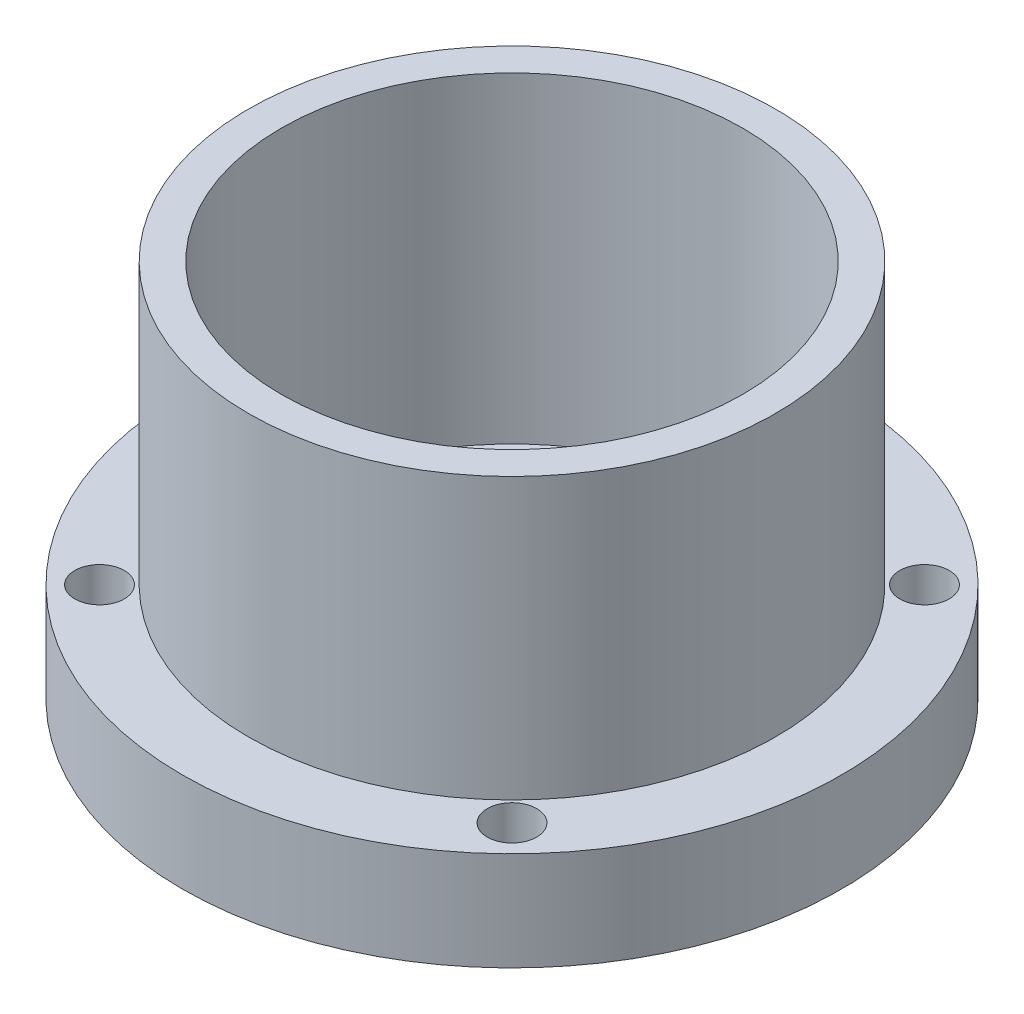
ISO-10303-21;
HEADER;
FILE_DESCRIPTION(('STEP AP214'),'2;1');
FILE_NAME('part.step','',(''),(''),'','','');
FILE_SCHEMA(('AUTOMOTIVE_DESIGN { 1 0 10303 214 1 1 1 1 }'));
ENDSEC;
DATA;
#1=APPLICATION_CONTEXT('core data for automotive mechanical design processes');
#2=APPLICATION_PROTOCOL_DEFINITION('international standard','automotive_design',2000,#1);
#3=PRODUCT_CONTEXT('',#1,'mechanical');
#4=PRODUCT('Part','Part','',(#3));
#5=PRODUCT_RELATED_PRODUCT_CATEGORY('part','',(#4));
#6=PRODUCT_DEFINITION_FORMATION('','',#4);
#7=PRODUCT_DEFINITION_CONTEXT('part definition',#1,'design');
#8=PRODUCT_DEFINITION('design','',#6,#7);
#9=PRODUCT_DEFINITION_SHAPE('','',#8);
#10=(LENGTH_UNIT() NAMED_UNIT(*) SI_UNIT(.MILLI.,.METRE.));
#11=(NAMED_UNIT(*) PLANE_ANGLE_UNIT() SI_UNIT($,.RADIAN.));
#12=(NAMED_UNIT(*) SI_UNIT($,.STERADIAN.) SOLID_ANGLE_UNIT());
#13=UNCERTAINTY_MEASURE_WITH_UNIT(LENGTH_MEASURE(1.E-05),#10,'distance_accuracy_value','');
#14=(GEOMETRIC_REPRESENTATION_CONTEXT(3) GLOBAL_UNCERTAINTY_ASSIGNED_CONTEXT((#13)) GLOBAL_UNIT_ASSIGNED_CONTEXT((#10,
#11,#12)) REPRESENTATION_CONTEXT('',''));
#15=CARTESIAN_POINT('',(0.,0.,0.));
#16=DIRECTION('',(0.,0.,1.));
#17=DIRECTION('',(1.,0.,0.));
#18=AXIS2_PLACEMENT_3D('',#15,#16,#17);
#19=CARTESIAN_POINT('',(-19.0091828831705,220.5,-53.2448828787845));
#20=DIRECTION('',(0.,1.,0.));
#21=DIRECTION('',(0.,0.,-1.));
#22=AXIS2_PLACEMENT_3D('',#19,#20,#21);
#23=CYLINDRICAL_SURFACE('',#22,16.);
#24=CARTESIAN_POINT('',(-19.0091828831705,220.5,-53.2448828787845));
#25=DIRECTION('',(0.,1.,0.));
#26=DIRECTION('',(0.,0.,1.));
#27=AXIS2_PLACEMENT_3D('',#24,#25,#26);
#28=CIRCLE('',#27,16.);
#29=CARTESIAN_POINT('',(-19.0091828831705,220.5,-37.2448828787845));
#30=VERTEX_POINT('',#29);
#31=EDGE_CURVE('E10',#30,#30,#28,.T.);
#32=ORIENTED_EDGE('',*,*,#31,.T.);
#33=EDGE_LOOP('',(#32));
#34=FACE_BOUND('',#33,.T.);
#35=CARTESIAN_POINT('',(-19.0091828831705,237.5,-53.2448828787845));
#36=DIRECTION('',(0.,1.,0.));
#37=DIRECTION('',(0.,0.,1.));
#38=AXIS2_PLACEMENT_3D('',#35,#36,#37);
#39=CIRCLE('',#38,16.);
#40=CARTESIAN_POINT('',(-19.0091828831705,237.5,-37.2448828787845));
#41=VERTEX_POINT('',#40);
#42=EDGE_CURVE('E46',#41,#41,#39,.T.);
#43=ORIENTED_EDGE('',*,*,#42,.F.);
#44=EDGE_LOOP('',(#43));
#45=FACE_BOUND('',#44,.T.);
#46=ADVANCED_FACE('F39',(#34,#45),#23,.T.);
#47=CARTESIAN_POINT('',(-19.0091828831705,237.5,-53.2448828787845));
#48=DIRECTION('',(0.,-1.,0.));
#49=DIRECTION('',(0.,0.,1.));
#50=AXIS2_PLACEMENT_3D('',#47,#48,#49);
#51=PLANE('',#50);
#52=CARTESIAN_POINT('',(-19.0091828831705,237.5,-53.2448828787845));
#53=DIRECTION('',(0.,1.,0.));
#54=DIRECTION('',(0.,0.,1.));
#55=AXIS2_PLACEMENT_3D('',#52,#53,#54);
#56=CIRCLE('',#55,14.);
#57=CARTESIAN_POINT('',(-19.0091828831705,237.5,-39.2448828787845));
#58=VERTEX_POINT('',#57);
#59=EDGE_CURVE('E60',#58,#58,#56,.F.);
#60=ORIENTED_EDGE('',*,*,#59,.T.);
#61=EDGE_LOOP('',(#60));
#62=FACE_BOUND('',#61,.T.);
#63=ORIENTED_EDGE('',*,*,#42,.T.);
#64=EDGE_LOOP('',(#63));
#65=FACE_BOUND('',#64,.T.);
#66=ADVANCED_FACE('F105',(#62,#65),#51,.F.);
#67=CARTESIAN_POINT('',(-19.0091828831705,214.5,-53.2448828787845));
#68=DIRECTION('',(0.,1.,0.));
#69=DIRECTION('',(0.,0.,-1.));
#70=AXIS2_PLACEMENT_3D('',#67,#68,#69);
#71=CYLINDRICAL_SURFACE('',#70,20.);
#72=CARTESIAN_POINT('',(-19.0091828831705,214.5,-53.2448828787845));
#73=DIRECTION('',(0.,1.,0.));
#74=DIRECTION('',(0.,0.,1.));
#75=AXIS2_PLACEMENT_3D('',#72,#73,#74);
#76=CIRCLE('',#75,20.);
#77=CARTESIAN_POINT('',(-19.0091828831705,214.5,-33.2448828787845));
#78=VERTEX_POINT('',#77);
#79=EDGE_CURVE('E51',#78,#78,#76,.T.);
#80=ORIENTED_EDGE('',*,*,#79,.T.);
#81=EDGE_LOOP('',(#80));
#82=FACE_BOUND('',#81,.T.);
#83=CARTESIAN_POINT('',(-19.0091828831705,220.5,-53.2448828787845));
#84=DIRECTION('',(0.,1.,0.));
#85=DIRECTION('',(0.,0.,1.));
#86=AXIS2_PLACEMENT_3D('',#83,#84,#85);
#87=CIRCLE('',#86,20.);
#88=CARTESIAN_POINT('',(-19.0091828831705,220.5,-33.2448828787845));
#89=VERTEX_POINT('',#88);
#90=EDGE_CURVE('E53',#89,#89,#87,.T.);
#91=ORIENTED_EDGE('',*,*,#90,.F.);
#92=EDGE_LOOP('',(#91));
#93=FACE_BOUND('',#92,.T.);
#94=ADVANCED_FACE('F100',(#82,#93),#71,.T.);
#95=CARTESIAN_POINT('',(-19.0091828831705,214.5,-53.2448828787845));
#96=DIRECTION('',(0.,-1.,0.));
#97=DIRECTION('',(0.,0.,1.));
#98=AXIS2_PLACEMENT_3D('',#95,#96,#97);
#99=PLANE('',#98);
#100=CARTESIAN_POINT('',(-6.49339285616864,214.5,-65.7606729057864));
#101=DIRECTION('',(0.,1.,0.));
#102=DIRECTION('',(0.,0.,1.));
#103=AXIS2_PLACEMENT_3D('',#100,#101,#102);
#104=CIRCLE('',#103,1.5);
#105=CARTESIAN_POINT('',(-6.49339285616864,214.5,-64.2606729057864));
#106=VERTEX_POINT('',#105);
#107=EDGE_CURVE('E83',#106,#106,#104,.F.);
#108=ORIENTED_EDGE('',*,*,#107,.F.);
#109=EDGE_LOOP('',(#108));
#110=FACE_BOUND('',#109,.T.);
#111=CARTESIAN_POINT('',(-31.5249729101724,214.5,-65.7606729057864));
#112=DIRECTION('',(0.,1.,0.));
#113=DIRECTION('',(0.,0.,1.));
#114=AXIS2_PLACEMENT_3D('',#111,#112,#113);
#115=CIRCLE('',#114,1.5);
#116=CARTESIAN_POINT('',(-31.5249729101724,214.5,-64.2606729057864));
#117=VERTEX_POINT('',#116);
#118=EDGE_CURVE('E71',#117,#117,#115,.F.);
#119=ORIENTED_EDGE('',*,*,#118,.F.);
#120=EDGE_LOOP('',(#119));
#121=FACE_BOUND('',#120,.T.);
#122=CARTESIAN_POINT('',(-31.5249729101724,214.5,-40.7290928517826));
#123=DIRECTION('',(0.,1.,0.));
#124=DIRECTION('',(0.,0.,1.));
#125=AXIS2_PLACEMENT_3D('',#122,#123,#124);
#126=CIRCLE('',#125,1.5);
#127=CARTESIAN_POINT('',(-31.5249729101724,214.5,-39.2290928517826));
#128=VERTEX_POINT('',#127);
#129=EDGE_CURVE('E72',#128,#128,#126,.F.);
#130=ORIENTED_EDGE('',*,*,#129,.F.);
#131=EDGE_LOOP('',(#130));
#132=FACE_BOUND('',#131,.T.);
#133=CARTESIAN_POINT('',(-6.49339285616864,214.5,-40.7290928517826));
#134=DIRECTION('',(0.,1.,0.));
#135=DIRECTION('',(0.,0.,1.));
#136=AXIS2_PLACEMENT_3D('',#133,#134,#135);
#137=CIRCLE('',#136,1.5);
#138=CARTESIAN_POINT('',(-6.49339285616864,214.5,-39.2290928517826));
#139=VERTEX_POINT('',#138);
#140=EDGE_CURVE('E69',#139,#139,#137,.F.);
#141=ORIENTED_EDGE('',*,*,#140,.F.);
#142=EDGE_LOOP('',(#141));
#143=FACE_BOUND('',#142,.T.);
#144=CARTESIAN_POINT('',(-19.0091828831705,214.5,-53.2448828787845));
#145=DIRECTION('',(0.,1.,0.));
#146=DIRECTION('',(0.,0.,1.));
#147=AXIS2_PLACEMENT_3D('',#144,#145,#146);
#148=CIRCLE('',#147,13.);
#149=CARTESIAN_POINT('',(-19.0091828831705,214.5,-40.2448828787845));
#150=VERTEX_POINT('',#149);
#151=EDGE_CURVE('E62',#150,#150,#148,.F.);
#152=ORIENTED_EDGE('',*,*,#151,.F.);
#153=EDGE_LOOP('',(#152));
#154=FACE_BOUND('',#153,.T.);
#155=ORIENTED_EDGE('',*,*,#79,.F.);
#156=EDGE_LOOP('',(#155));
#157=FACE_BOUND('',#156,.T.);
#158=ADVANCED_FACE('F103',(#110,#121,#132,#143,#154,#157),#99,.T.);
#159=CARTESIAN_POINT('',(-19.0091828831705,220.5,-53.2448828787845));
#160=DIRECTION('',(0.,-1.,0.));
#161=DIRECTION('',(0.,0.,1.));
#162=AXIS2_PLACEMENT_3D('',#159,#160,#161);
#163=PLANE('',#162);
#164=CARTESIAN_POINT('',(-6.49339285616864,220.5,-65.7606729057864));
#165=DIRECTION('',(0.,1.,0.));
#166=DIRECTION('',(0.,0.,1.));
#167=AXIS2_PLACEMENT_3D('',#164,#165,#166);
#168=CIRCLE('',#167,1.5);
#169=CARTESIAN_POINT('',(-6.49339285616864,220.5,-64.2606729057864));
#170=VERTEX_POINT('',#169);
#171=EDGE_CURVE('E45',#170,#170,#168,.F.);
#172=ORIENTED_EDGE('',*,*,#171,.T.);
#173=EDGE_LOOP('',(#172));
#174=FACE_BOUND('',#173,.T.);
#175=CARTESIAN_POINT('',(-31.5249729101724,220.5,-65.7606729057864));
#176=DIRECTION('',(0.,1.,0.));
#177=DIRECTION('',(0.,0.,1.));
#178=AXIS2_PLACEMENT_3D('',#175,#176,#177);
#179=CIRCLE('',#178,1.5);
#180=CARTESIAN_POINT('',(-31.5249729101724,220.5,-64.2606729057864));
#181=VERTEX_POINT('',#180);
#182=EDGE_CURVE('E74',#181,#181,#179,.F.);
#183=ORIENTED_EDGE('',*,*,#182,.T.);
#184=EDGE_LOOP('',(#183));
#185=FACE_BOUND('',#184,.T.);
#186=CARTESIAN_POINT('',(-31.5249729101724,220.5,-40.7290928517826));
#187=DIRECTION('',(0.,1.,0.));
#188=DIRECTION('',(0.,0.,1.));
#189=AXIS2_PLACEMENT_3D('',#186,#187,#188);
#190=CIRCLE('',#189,1.5);
#191=CARTESIAN_POINT('',(-31.5249729101724,220.5,-39.2290928517826));
#192=VERTEX_POINT('',#191);
#193=EDGE_CURVE('E66',#192,#192,#190,.F.);
#194=ORIENTED_EDGE('',*,*,#193,.T.);
#195=EDGE_LOOP('',(#194));
#196=FACE_BOUND('',#195,.T.);
#197=CARTESIAN_POINT('',(-6.49339285616864,220.5,-40.7290928517826));
#198=DIRECTION('',(0.,1.,0.));
#199=DIRECTION('',(0.,0.,1.));
#200=AXIS2_PLACEMENT_3D('',#197,#198,#199);
#201=CIRCLE('',#200,1.5);
#202=CARTESIAN_POINT('',(-6.49339285616864,220.5,-39.2290928517826));
#203=VERTEX_POINT('',#202);
#204=EDGE_CURVE('E63',#203,#203,#201,.F.);
#205=ORIENTED_EDGE('',*,*,#204,.T.);
#206=EDGE_LOOP('',(#205));
#207=FACE_BOUND('',#206,.T.);
#208=ORIENTED_EDGE('',*,*,#31,.F.);
#209=EDGE_LOOP('',(#208));
#210=FACE_BOUND('',#209,.T.);
#211=ORIENTED_EDGE('',*,*,#90,.T.);
#212=EDGE_LOOP('',(#211));
#213=FACE_BOUND('',#212,.T.);
#214=ADVANCED_FACE('F97',(#174,#185,#196,#207,#210,#213),#163,.F.);
#215=CARTESIAN_POINT('',(-19.0091828831705,218.,-53.2448828787845));
#216=DIRECTION('',(0.,1.,0.));
#217=DIRECTION('',(0.,0.,-1.));
#218=AXIS2_PLACEMENT_3D('',#215,#216,#217);
#219=CYLINDRICAL_SURFACE('',#218,14.);
#220=CARTESIAN_POINT('',(-19.0091828831705,218.,-53.2448828787845));
#221=DIRECTION('',(0.,1.,0.));
#222=DIRECTION('',(0.,0.,1.));
#223=AXIS2_PLACEMENT_3D('',#220,#221,#222);
#224=CIRCLE('',#223,14.);
#225=CARTESIAN_POINT('',(-19.0091828831705,218.,-39.2448828787845));
#226=VERTEX_POINT('',#225);
#227=EDGE_CURVE('E58',#226,#226,#224,.T.);
#228=ORIENTED_EDGE('',*,*,#227,.F.);
#229=EDGE_LOOP('',(#228));
#230=FACE_BOUND('',#229,.T.);
#231=ORIENTED_EDGE('',*,*,#59,.F.);
#232=EDGE_LOOP('',(#231));
#233=FACE_BOUND('',#232,.T.);
#234=ADVANCED_FACE('F143',(#230,#233),#219,.F.);
#235=CARTESIAN_POINT('',(-19.0091828831705,218.,-53.2448828787845));
#236=DIRECTION('',(0.,-1.,0.));
#237=DIRECTION('',(0.,0.,1.));
#238=AXIS2_PLACEMENT_3D('',#235,#236,#237);
#239=PLANE('',#238);
#240=CARTESIAN_POINT('',(-19.0091828831705,218.,-53.2448828787845));
#241=DIRECTION('',(0.,1.,0.));
#242=DIRECTION('',(0.,0.,1.));
#243=AXIS2_PLACEMENT_3D('',#240,#241,#242);
#244=CIRCLE('',#243,13.);
#245=CARTESIAN_POINT('',(-19.0091828831705,218.,-40.2448828787845));
#246=VERTEX_POINT('',#245);
#247=EDGE_CURVE('E61',#246,#246,#244,.T.);
#248=ORIENTED_EDGE('',*,*,#247,.F.);
#249=EDGE_LOOP('',(#248));
#250=FACE_BOUND('',#249,.T.);
#251=ORIENTED_EDGE('',*,*,#227,.T.);
#252=EDGE_LOOP('',(#251));
#253=FACE_BOUND('',#252,.T.);
#254=ADVANCED_FACE('F154',(#250,#253),#239,.F.);
#255=CARTESIAN_POINT('',(-19.0091828831705,214.4,-53.2448828787845));
#256=DIRECTION('',(0.,1.,0.));
#257=DIRECTION('',(0.,0.,-1.));
#258=AXIS2_PLACEMENT_3D('',#255,#256,#257);
#259=CYLINDRICAL_SURFACE('',#258,13.);
#260=ORIENTED_EDGE('',*,*,#151,.T.);
#261=EDGE_LOOP('',(#260));
#262=FACE_BOUND('',#261,.T.);
#263=ORIENTED_EDGE('',*,*,#247,.T.);
#264=EDGE_LOOP('',(#263));
#265=FACE_BOUND('',#264,.T.);
#266=ADVANCED_FACE('F161',(#262,#265),#259,.F.);
#267=CARTESIAN_POINT('',(-6.49339285616864,214.4,-40.7290928517826));
#268=DIRECTION('',(0.,1.,0.));
#269=DIRECTION('',(0.,0.,-1.));
#270=AXIS2_PLACEMENT_3D('',#267,#268,#269);
#271=CYLINDRICAL_SURFACE('',#270,1.5);
#272=ORIENTED_EDGE('',*,*,#140,.T.);
#273=EDGE_LOOP('',(#272));
#274=FACE_BOUND('',#273,.T.);
#275=ORIENTED_EDGE('',*,*,#204,.F.);
#276=EDGE_LOOP('',(#275));
#277=FACE_BOUND('',#276,.T.);
#278=ADVANCED_FACE('F173',(#274,#277),#271,.F.);
#279=CARTESIAN_POINT('',(-31.5249729101724,214.4,-40.7290928517826));
#280=DIRECTION('',(0.,1.,0.));
#281=DIRECTION('',(0.,0.,-1.));
#282=AXIS2_PLACEMENT_3D('',#279,#280,#281);
#283=CYLINDRICAL_SURFACE('',#282,1.5);
#284=ORIENTED_EDGE('',*,*,#129,.T.);
#285=EDGE_LOOP('',(#284));
#286=FACE_BOUND('',#285,.T.);
#287=ORIENTED_EDGE('',*,*,#193,.F.);
#288=EDGE_LOOP('',(#287));
#289=FACE_BOUND('',#288,.T.);
#290=ADVANCED_FACE('F182',(#286,#289),#283,.F.);
#291=CARTESIAN_POINT('',(-31.5249729101724,214.4,-65.7606729057864));
#292=DIRECTION('',(0.,1.,0.));
#293=DIRECTION('',(0.,0.,-1.));
#294=AXIS2_PLACEMENT_3D('',#291,#292,#293);
#295=CYLINDRICAL_SURFACE('',#294,1.5);
#296=ORIENTED_EDGE('',*,*,#118,.T.);
#297=EDGE_LOOP('',(#296));
#298=FACE_BOUND('',#297,.T.);
#299=ORIENTED_EDGE('',*,*,#182,.F.);
#300=EDGE_LOOP('',(#299));
#301=FACE_BOUND('',#300,.T.);
#302=ADVANCED_FACE('F194',(#298,#301),#295,.F.);
#303=CARTESIAN_POINT('',(-6.49339285616864,214.4,-65.7606729057864));
#304=DIRECTION('',(0.,1.,0.));
#305=DIRECTION('',(0.,0.,-1.));
#306=AXIS2_PLACEMENT_3D('',#303,#304,#305);
#307=CYLINDRICAL_SURFACE('',#306,1.5);
#308=ORIENTED_EDGE('',*,*,#107,.T.);
#309=EDGE_LOOP('',(#308));
#310=FACE_BOUND('',#309,.T.);
#311=ORIENTED_EDGE('',*,*,#171,.F.);
#312=EDGE_LOOP('',(#311));
#313=FACE_BOUND('',#312,.T.);
#314=ADVANCED_FACE('F204',(#310,#313),#307,.F.);
#315=CLOSED_SHELL('',(#46,#66,#94,#158,#214,#234,#254,#266,#278,#290,#302,#314));
#316=MANIFOLD_SOLID_BREP('B2',#315);
#317=ADVANCED_BREP_SHAPE_REPRESENTATION('',(#18,#316),#14);
#318=SHAPE_DEFINITION_REPRESENTATION(#9,#317);
ENDSEC;
END-ISO-10303-21;
